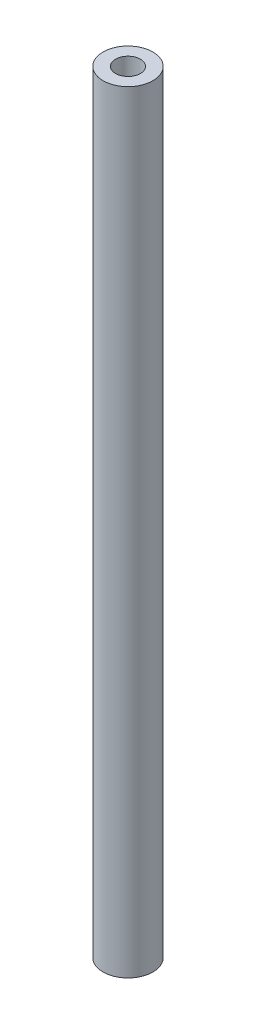
ISO-10303-21;
HEADER;
FILE_DESCRIPTION(('STEP AP214'),'2;1');
FILE_NAME('part.step','',(''),(''),'','','');
FILE_SCHEMA(('AUTOMOTIVE_DESIGN { 1 0 10303 214 1 1 1 1 }'));
ENDSEC;
DATA;
#1=APPLICATION_CONTEXT('core data for automotive mechanical design processes');
#2=APPLICATION_PROTOCOL_DEFINITION('international standard','automotive_design',2000,#1);
#3=PRODUCT_CONTEXT('',#1,'mechanical');
#4=PRODUCT('Part','Part','',(#3));
#5=PRODUCT_RELATED_PRODUCT_CATEGORY('part','',(#4));
#6=PRODUCT_DEFINITION_FORMATION('','',#4);
#7=PRODUCT_DEFINITION_CONTEXT('part definition',#1,'design');
#8=PRODUCT_DEFINITION('design','',#6,#7);
#9=PRODUCT_DEFINITION_SHAPE('','',#8);
#10=(LENGTH_UNIT() NAMED_UNIT(*) SI_UNIT(.MILLI.,.METRE.));
#11=(NAMED_UNIT(*) PLANE_ANGLE_UNIT() SI_UNIT($,.RADIAN.));
#12=(NAMED_UNIT(*) SI_UNIT($,.STERADIAN.) SOLID_ANGLE_UNIT());
#13=UNCERTAINTY_MEASURE_WITH_UNIT(LENGTH_MEASURE(1.E-05),#10,'distance_accuracy_value','');
#14=(GEOMETRIC_REPRESENTATION_CONTEXT(3) GLOBAL_UNCERTAINTY_ASSIGNED_CONTEXT((#13)) GLOBAL_UNIT_ASSIGNED_CONTEXT((#10,
#11,#12)) REPRESENTATION_CONTEXT('',''));
#15=CARTESIAN_POINT('',(0.,0.,0.));
#16=DIRECTION('',(0.,0.,1.));
#17=DIRECTION('',(1.,0.,0.));
#18=AXIS2_PLACEMENT_3D('',#15,#16,#17);
#19=CARTESIAN_POINT('',(0.,62.,0.));
#20=DIRECTION('',(0.,1.,0.));
#21=DIRECTION('',(0.,0.,1.));
#22=AXIS2_PLACEMENT_3D('',#19,#20,#21);
#23=PLANE('',#22);
#24=CARTESIAN_POINT('',(0.,62.,0.));
#25=DIRECTION('',(0.,1.,0.));
#26=DIRECTION('',(0.,0.,1.));
#27=AXIS2_PLACEMENT_3D('',#24,#25,#26);
#28=CIRCLE('',#27,2.);
#29=CARTESIAN_POINT('',(0.,62.,2.));
#30=VERTEX_POINT('',#29);
#31=EDGE_CURVE('E10',#30,#30,#28,.T.);
#32=ORIENTED_EDGE('',*,*,#31,.T.);
#33=EDGE_LOOP('',(#32));
#34=FACE_BOUND('',#33,.T.);
#35=CARTESIAN_POINT('',(0.,62.,0.));
#36=DIRECTION('',(0.,1.,0.));
#37=DIRECTION('',(0.,0.,1.));
#38=AXIS2_PLACEMENT_3D('',#35,#36,#37);
#39=CIRCLE('',#38,1.);
#40=CARTESIAN_POINT('',(0.,62.,1.));
#41=VERTEX_POINT('',#40);
#42=EDGE_CURVE('E39',#41,#41,#39,.T.);
#43=ORIENTED_EDGE('',*,*,#42,.F.);
#44=EDGE_LOOP('',(#43));
#45=FACE_BOUND('',#44,.T.);
#46=ADVANCED_FACE('F28',(#34,#45),#23,.T.);
#47=CARTESIAN_POINT('',(0.,0.,0.));
#48=DIRECTION('',(0.,1.,0.));
#49=DIRECTION('',(0.,0.,1.));
#50=AXIS2_PLACEMENT_3D('',#47,#48,#49);
#51=PLANE('',#50);
#52=CARTESIAN_POINT('',(0.,0.,0.));
#53=DIRECTION('',(0.,1.,0.));
#54=DIRECTION('',(0.,0.,1.));
#55=AXIS2_PLACEMENT_3D('',#52,#53,#54);
#56=CIRCLE('',#55,2.);
#57=CARTESIAN_POINT('',(0.,0.,2.));
#58=VERTEX_POINT('',#57);
#59=EDGE_CURVE('E32',#58,#58,#56,.T.);
#60=ORIENTED_EDGE('',*,*,#59,.F.);
#61=EDGE_LOOP('',(#60));
#62=FACE_BOUND('',#61,.T.);
#63=CARTESIAN_POINT('',(0.,0.,0.));
#64=DIRECTION('',(0.,1.,0.));
#65=DIRECTION('',(0.,0.,1.));
#66=AXIS2_PLACEMENT_3D('',#63,#64,#65);
#67=CIRCLE('',#66,1.);
#68=CARTESIAN_POINT('',(0.,0.,1.));
#69=VERTEX_POINT('',#68);
#70=EDGE_CURVE('E41',#69,#69,#67,.T.);
#71=ORIENTED_EDGE('',*,*,#70,.T.);
#72=EDGE_LOOP('',(#71));
#73=FACE_BOUND('',#72,.T.);
#74=ADVANCED_FACE('F51',(#62,#73),#51,.F.);
#75=CARTESIAN_POINT('',(0.,62.,0.));
#76=DIRECTION('',(0.,-1.,0.));
#77=DIRECTION('',(0.,0.,-1.));
#78=AXIS2_PLACEMENT_3D('',#75,#76,#77);
#79=CYLINDRICAL_SURFACE('',#78,2.);
#80=ORIENTED_EDGE('',*,*,#31,.F.);
#81=EDGE_LOOP('',(#80));
#82=FACE_BOUND('',#81,.T.);
#83=ORIENTED_EDGE('',*,*,#59,.T.);
#84=EDGE_LOOP('',(#83));
#85=FACE_BOUND('',#84,.T.);
#86=ADVANCED_FACE('F30',(#82,#85),#79,.T.);
#87=CARTESIAN_POINT('',(0.,62.,0.));
#88=DIRECTION('',(0.,-1.,0.));
#89=DIRECTION('',(0.,0.,-1.));
#90=AXIS2_PLACEMENT_3D('',#87,#88,#89);
#91=CYLINDRICAL_SURFACE('',#90,1.);
#92=ORIENTED_EDGE('',*,*,#42,.T.);
#93=EDGE_LOOP('',(#92));
#94=FACE_BOUND('',#93,.T.);
#95=ORIENTED_EDGE('',*,*,#70,.F.);
#96=EDGE_LOOP('',(#95));
#97=FACE_BOUND('',#96,.T.);
#98=ADVANCED_FACE('F47',(#94,#97),#91,.F.);
#99=CLOSED_SHELL('',(#46,#74,#86,#98));
#100=MANIFOLD_SOLID_BREP('B2',#99);
#101=ADVANCED_BREP_SHAPE_REPRESENTATION('',(#18,#100),#14);
#102=SHAPE_DEFINITION_REPRESENTATION(#9,#101);
ENDSEC;
END-ISO-10303-21;
